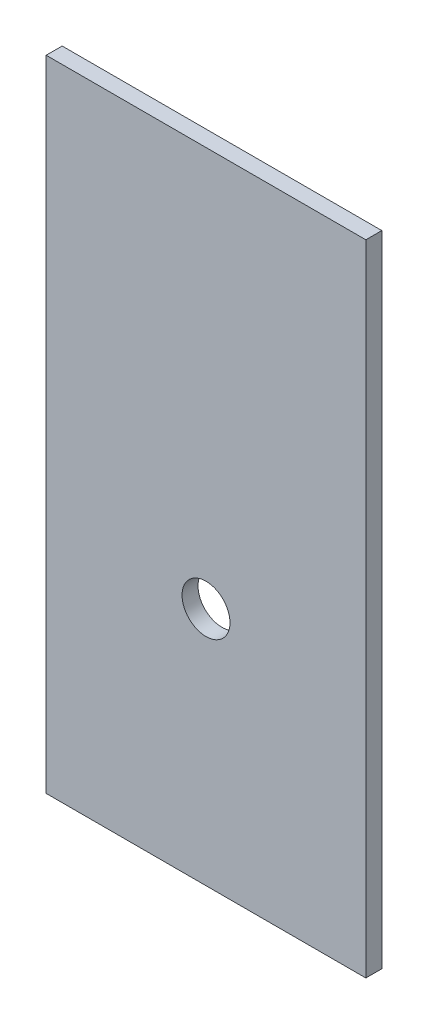
ISO-10303-21;
HEADER;
FILE_DESCRIPTION(('STEP AP214'),'2;1');
FILE_NAME('part.step','',(''),(''),'','','');
FILE_SCHEMA(('AUTOMOTIVE_DESIGN { 1 0 10303 214 1 1 1 1 }'));
ENDSEC;
DATA;
#1=APPLICATION_CONTEXT('core data for automotive mechanical design processes');
#2=APPLICATION_PROTOCOL_DEFINITION('international standard','automotive_design',2000,#1);
#3=PRODUCT_CONTEXT('',#1,'mechanical');
#4=PRODUCT('Part','Part','',(#3));
#5=PRODUCT_RELATED_PRODUCT_CATEGORY('part','',(#4));
#6=PRODUCT_DEFINITION_FORMATION('','',#4);
#7=PRODUCT_DEFINITION_CONTEXT('part definition',#1,'design');
#8=PRODUCT_DEFINITION('design','',#6,#7);
#9=PRODUCT_DEFINITION_SHAPE('','',#8);
#10=(LENGTH_UNIT() NAMED_UNIT(*) SI_UNIT(.MILLI.,.METRE.));
#11=(NAMED_UNIT(*) PLANE_ANGLE_UNIT() SI_UNIT($,.RADIAN.));
#12=(NAMED_UNIT(*) SI_UNIT($,.STERADIAN.) SOLID_ANGLE_UNIT());
#13=UNCERTAINTY_MEASURE_WITH_UNIT(LENGTH_MEASURE(1.E-05),#10,'distance_accuracy_value','');
#14=(GEOMETRIC_REPRESENTATION_CONTEXT(3) GLOBAL_UNCERTAINTY_ASSIGNED_CONTEXT((#13)) GLOBAL_UNIT_ASSIGNED_CONTEXT((#10,
#11,#12)) REPRESENTATION_CONTEXT('',''));
#15=CARTESIAN_POINT('',(0.,0.,0.));
#16=DIRECTION('',(0.,0.,1.));
#17=DIRECTION('',(1.,0.,0.));
#18=AXIS2_PLACEMENT_3D('',#15,#16,#17);
#19=CARTESIAN_POINT('',(0.,0.,10.));
#20=DIRECTION('',(0.,0.,-1.));
#21=DIRECTION('',(-1.,0.,0.));
#22=AXIS2_PLACEMENT_3D('',#19,#20,#21);
#23=PLANE('',#22);
#24=DIRECTION('',(0.,1.,0.));
#25=VECTOR('',#24,1.);
#26=CARTESIAN_POINT('',(100.,-200.,10.));
#27=LINE('',#26,#25);
#28=CARTESIAN_POINT('',(100.,-200.,10.));
#29=VERTEX_POINT('',#28);
#30=CARTESIAN_POINT('',(100.,200.,10.));
#31=VERTEX_POINT('',#30);
#32=EDGE_CURVE('E98',#29,#31,#27,.T.);
#33=ORIENTED_EDGE('',*,*,#32,.T.);
#34=DIRECTION('',(-1.,0.,0.));
#35=VECTOR('',#34,1.);
#36=CARTESIAN_POINT('',(-100.,200.,10.));
#37=LINE('',#36,#35);
#38=CARTESIAN_POINT('',(-100.,200.,10.));
#39=VERTEX_POINT('',#38);
#40=EDGE_CURVE('E93',#31,#39,#37,.T.);
#41=ORIENTED_EDGE('',*,*,#40,.T.);
#42=DIRECTION('',(0.,-1.,0.));
#43=VECTOR('',#42,1.);
#44=CARTESIAN_POINT('',(-100.,-200.,10.));
#45=LINE('',#44,#43);
#46=CARTESIAN_POINT('',(-100.,-200.,10.));
#47=VERTEX_POINT('',#46);
#48=EDGE_CURVE('E96',#39,#47,#45,.T.);
#49=ORIENTED_EDGE('',*,*,#48,.T.);
#50=DIRECTION('',(1.,0.,0.));
#51=VECTOR('',#50,1.);
#52=CARTESIAN_POINT('',(-100.,-200.,10.));
#53=LINE('',#52,#51);
#54=EDGE_CURVE('E63',#47,#29,#53,.T.);
#55=ORIENTED_EDGE('',*,*,#54,.T.);
#56=EDGE_LOOP('',(#33,#41,#49,#55));
#57=FACE_BOUND('',#56,.T.);
#58=CARTESIAN_POINT('',(0.,-50.,10.));
#59=DIRECTION('',(0.,0.,1.));
#60=DIRECTION('',(1.,0.,0.));
#61=AXIS2_PLACEMENT_3D('',#58,#59,#60);
#62=CIRCLE('',#61,15.);
#63=CARTESIAN_POINT('',(15.,-50.,10.));
#64=VERTEX_POINT('',#63);
#65=EDGE_CURVE('E118',#64,#64,#62,.T.);
#66=ORIENTED_EDGE('',*,*,#65,.F.);
#67=EDGE_LOOP('',(#66));
#68=FACE_BOUND('',#67,.T.);
#69=ADVANCED_FACE('F45',(#57,#68),#23,.F.);
#70=CARTESIAN_POINT('',(0.,0.,0.));
#71=DIRECTION('',(0.,0.,-1.));
#72=DIRECTION('',(-1.,0.,0.));
#73=AXIS2_PLACEMENT_3D('',#70,#71,#72);
#74=PLANE('',#73);
#75=DIRECTION('',(0.,1.,0.));
#76=VECTOR('',#75,1.);
#77=CARTESIAN_POINT('',(100.,-200.,0.));
#78=LINE('',#77,#76);
#79=CARTESIAN_POINT('',(100.,-200.,0.));
#80=VERTEX_POINT('',#79);
#81=CARTESIAN_POINT('',(100.,200.,0.));
#82=VERTEX_POINT('',#81);
#83=EDGE_CURVE('E114',#80,#82,#78,.T.);
#84=ORIENTED_EDGE('',*,*,#83,.F.);
#85=DIRECTION('',(1.,0.,0.));
#86=VECTOR('',#85,1.);
#87=CARTESIAN_POINT('',(-100.,-200.,0.));
#88=LINE('',#87,#86);
#89=CARTESIAN_POINT('',(-100.,-200.,0.));
#90=VERTEX_POINT('',#89);
#91=EDGE_CURVE('E86',#90,#80,#88,.T.);
#92=ORIENTED_EDGE('',*,*,#91,.F.);
#93=DIRECTION('',(0.,-1.,0.));
#94=VECTOR('',#93,1.);
#95=CARTESIAN_POINT('',(-100.,-200.,0.));
#96=LINE('',#95,#94);
#97=CARTESIAN_POINT('',(-100.,200.,0.));
#98=VERTEX_POINT('',#97);
#99=EDGE_CURVE('E80',#98,#90,#96,.T.);
#100=ORIENTED_EDGE('',*,*,#99,.F.);
#101=DIRECTION('',(-1.,0.,0.));
#102=VECTOR('',#101,1.);
#103=CARTESIAN_POINT('',(-100.,200.,0.));
#104=LINE('',#103,#102);
#105=EDGE_CURVE('E103',#82,#98,#104,.T.);
#106=ORIENTED_EDGE('',*,*,#105,.F.);
#107=EDGE_LOOP('',(#84,#92,#100,#106));
#108=FACE_BOUND('',#107,.T.);
#109=CARTESIAN_POINT('',(0.,-50.,0.));
#110=DIRECTION('',(0.,0.,1.));
#111=DIRECTION('',(1.,0.,0.));
#112=AXIS2_PLACEMENT_3D('',#109,#110,#111);
#113=CIRCLE('',#112,15.);
#114=CARTESIAN_POINT('',(15.,-50.,0.));
#115=VERTEX_POINT('',#114);
#116=EDGE_CURVE('E136',#115,#115,#113,.T.);
#117=ORIENTED_EDGE('',*,*,#116,.T.);
#118=EDGE_LOOP('',(#117));
#119=FACE_BOUND('',#118,.T.);
#120=ADVANCED_FACE('F131',(#108,#119),#74,.T.);
#121=CARTESIAN_POINT('',(100.,-200.,10.));
#122=DIRECTION('',(-1.,0.,0.));
#123=DIRECTION('',(0.,0.,1.));
#124=AXIS2_PLACEMENT_3D('',#121,#122,#123);
#125=PLANE('',#124);
#126=ORIENTED_EDGE('',*,*,#83,.T.);
#127=DIRECTION('',(0.,0.,-1.));
#128=VECTOR('',#127,1.);
#129=CARTESIAN_POINT('',(100.,200.,10.));
#130=LINE('',#129,#128);
#131=EDGE_CURVE('E11',#31,#82,#130,.T.);
#132=ORIENTED_EDGE('',*,*,#131,.F.);
#133=ORIENTED_EDGE('',*,*,#32,.F.);
#134=DIRECTION('',(0.,0.,-1.));
#135=VECTOR('',#134,1.);
#136=CARTESIAN_POINT('',(100.,-200.,10.));
#137=LINE('',#136,#135);
#138=EDGE_CURVE('E110',#29,#80,#137,.T.);
#139=ORIENTED_EDGE('',*,*,#138,.T.);
#140=EDGE_LOOP('',(#126,#132,#133,#139));
#141=FACE_BOUND('',#140,.T.);
#142=ADVANCED_FACE('F47',(#141),#125,.F.);
#143=CARTESIAN_POINT('',(-100.,200.,10.));
#144=DIRECTION('',(0.,-1.,0.));
#145=DIRECTION('',(0.,0.,-1.));
#146=AXIS2_PLACEMENT_3D('',#143,#144,#145);
#147=PLANE('',#146);
#148=ORIENTED_EDGE('',*,*,#105,.T.);
#149=DIRECTION('',(0.,0.,-1.));
#150=VECTOR('',#149,1.);
#151=CARTESIAN_POINT('',(-100.,200.,10.));
#152=LINE('',#151,#150);
#153=EDGE_CURVE('E55',#39,#98,#152,.T.);
#154=ORIENTED_EDGE('',*,*,#153,.F.);
#155=ORIENTED_EDGE('',*,*,#40,.F.);
#156=ORIENTED_EDGE('',*,*,#131,.T.);
#157=EDGE_LOOP('',(#148,#154,#155,#156));
#158=FACE_BOUND('',#157,.T.);
#159=ADVANCED_FACE('F102',(#158),#147,.F.);
#160=CARTESIAN_POINT('',(-100.,-200.,10.));
#161=DIRECTION('',(1.,0.,0.));
#162=DIRECTION('',(0.,0.,-1.));
#163=AXIS2_PLACEMENT_3D('',#160,#161,#162);
#164=PLANE('',#163);
#165=ORIENTED_EDGE('',*,*,#99,.T.);
#166=DIRECTION('',(0.,0.,-1.));
#167=VECTOR('',#166,1.);
#168=CARTESIAN_POINT('',(-100.,-200.,10.));
#169=LINE('',#168,#167);
#170=EDGE_CURVE('E105',#47,#90,#169,.T.);
#171=ORIENTED_EDGE('',*,*,#170,.F.);
#172=ORIENTED_EDGE('',*,*,#48,.F.);
#173=ORIENTED_EDGE('',*,*,#153,.T.);
#174=EDGE_LOOP('',(#165,#171,#172,#173));
#175=FACE_BOUND('',#174,.T.);
#176=ADVANCED_FACE('F106',(#175),#164,.F.);
#177=CARTESIAN_POINT('',(-100.,-200.,10.));
#178=DIRECTION('',(0.,1.,0.));
#179=DIRECTION('',(0.,0.,1.));
#180=AXIS2_PLACEMENT_3D('',#177,#178,#179);
#181=PLANE('',#180);
#182=ORIENTED_EDGE('',*,*,#91,.T.);
#183=ORIENTED_EDGE('',*,*,#138,.F.);
#184=ORIENTED_EDGE('',*,*,#54,.F.);
#185=ORIENTED_EDGE('',*,*,#170,.T.);
#186=EDGE_LOOP('',(#182,#183,#184,#185));
#187=FACE_BOUND('',#186,.T.);
#188=ADVANCED_FACE('F128',(#187),#181,.F.);
#189=CARTESIAN_POINT('',(0.,-50.,10.));
#190=DIRECTION('',(0.,0.,-1.));
#191=DIRECTION('',(-1.,0.,0.));
#192=AXIS2_PLACEMENT_3D('',#189,#190,#191);
#193=CYLINDRICAL_SURFACE('',#192,15.);
#194=ORIENTED_EDGE('',*,*,#65,.T.);
#195=EDGE_LOOP('',(#194));
#196=FACE_BOUND('',#195,.T.);
#197=ORIENTED_EDGE('',*,*,#116,.F.);
#198=EDGE_LOOP('',(#197));
#199=FACE_BOUND('',#198,.T.);
#200=ADVANCED_FACE('F144',(#196,#199),#193,.F.);
#201=CLOSED_SHELL('',(#69,#120,#142,#159,#176,#188,#200));
#202=MANIFOLD_SOLID_BREP('B2',#201);
#203=ADVANCED_BREP_SHAPE_REPRESENTATION('',(#18,#202),#14);
#204=SHAPE_DEFINITION_REPRESENTATION(#9,#203);
ENDSEC;
END-ISO-10303-21;
